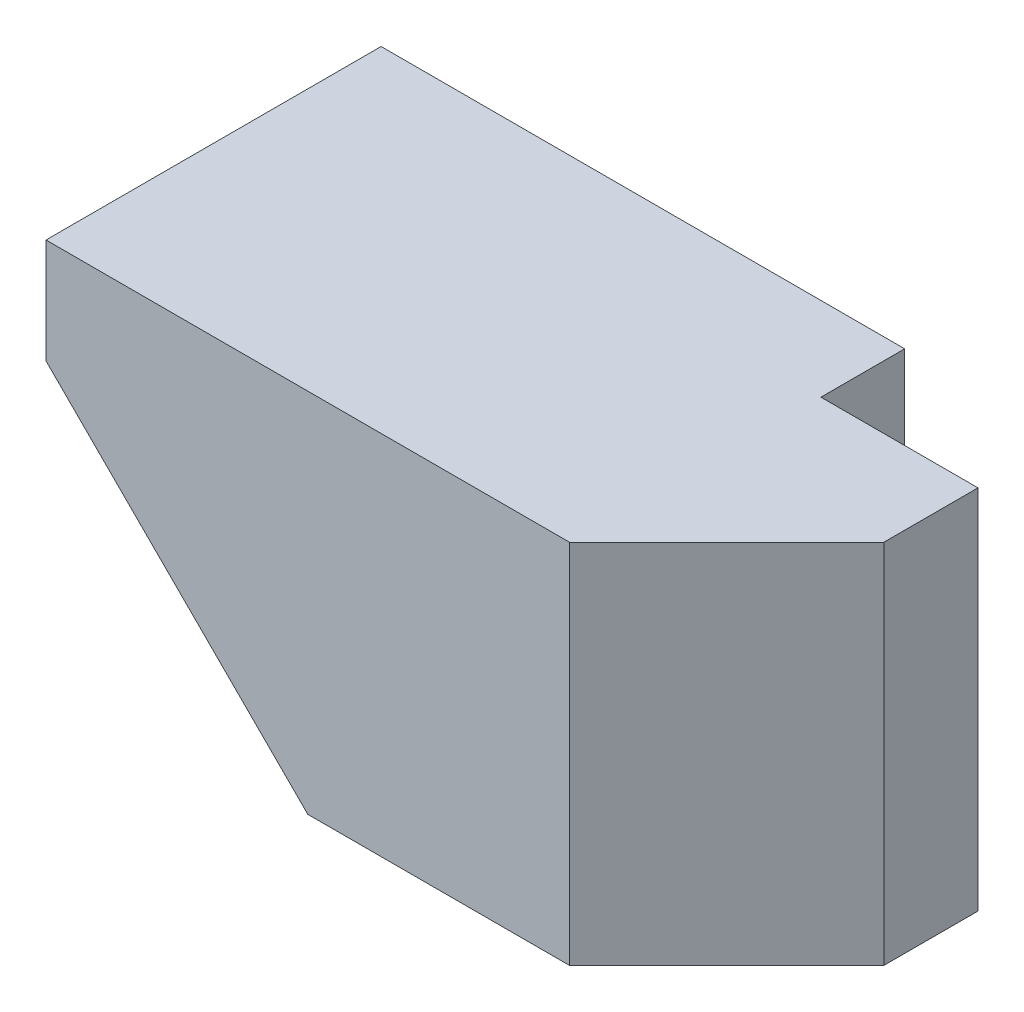
ISO-10303-21;
HEADER;
FILE_DESCRIPTION(('STEP AP214'),'2;1');
FILE_NAME('part.step','',(''),(''),'','','');
FILE_SCHEMA(('AUTOMOTIVE_DESIGN { 1 0 10303 214 1 1 1 1 }'));
ENDSEC;
DATA;
#1=APPLICATION_CONTEXT('core data for automotive mechanical design processes');
#2=APPLICATION_PROTOCOL_DEFINITION('international standard','automotive_design',2000,#1);
#3=PRODUCT_CONTEXT('',#1,'mechanical');
#4=PRODUCT('Part','Part','',(#3));
#5=PRODUCT_RELATED_PRODUCT_CATEGORY('part','',(#4));
#6=PRODUCT_DEFINITION_FORMATION('','',#4);
#7=PRODUCT_DEFINITION_CONTEXT('part definition',#1,'design');
#8=PRODUCT_DEFINITION('design','',#6,#7);
#9=PRODUCT_DEFINITION_SHAPE('','',#8);
#10=(LENGTH_UNIT() NAMED_UNIT(*) SI_UNIT(.MILLI.,.METRE.));
#11=(NAMED_UNIT(*) PLANE_ANGLE_UNIT() SI_UNIT($,.RADIAN.));
#12=(NAMED_UNIT(*) SI_UNIT($,.STERADIAN.) SOLID_ANGLE_UNIT());
#13=UNCERTAINTY_MEASURE_WITH_UNIT(LENGTH_MEASURE(1.E-05),#10,'distance_accuracy_value','');
#14=(GEOMETRIC_REPRESENTATION_CONTEXT(3) GLOBAL_UNCERTAINTY_ASSIGNED_CONTEXT((#13)) GLOBAL_UNIT_ASSIGNED_CONTEXT((#10,
#11,#12)) REPRESENTATION_CONTEXT('',''));
#15=CARTESIAN_POINT('',(0.,0.,0.));
#16=DIRECTION('',(0.,0.,1.));
#17=DIRECTION('',(1.,0.,0.));
#18=AXIS2_PLACEMENT_3D('',#15,#16,#17);
#19=CARTESIAN_POINT('',(37.9273504273504,-14.732905982906,12.));
#20=DIRECTION('',(-1.,0.,0.));
#21=DIRECTION('',(0.,0.,1.));
#22=AXIS2_PLACEMENT_3D('',#19,#20,#21);
#23=PLANE('',#22);
#24=DIRECTION('',(0.,0.,-1.));
#25=VECTOR('',#24,1.);
#26=CARTESIAN_POINT('',(37.9273504273504,20.267094017094,12.));
#27=LINE('',#26,#25);
#28=CARTESIAN_POINT('',(37.9273504273504,20.267094017094,17.));
#29=VERTEX_POINT('',#28);
#30=CARTESIAN_POINT('',(37.9273504273504,20.267094017094,8.));
#31=VERTEX_POINT('',#30);
#32=EDGE_CURVE('E180',#29,#31,#27,.T.);
#33=ORIENTED_EDGE('',*,*,#32,.F.);
#34=DIRECTION('',(0.,-1.,0.));
#35=VECTOR('',#34,1.);
#36=CARTESIAN_POINT('',(37.9273504273504,26.267094017094,17.));
#37=LINE('',#36,#35);
#38=CARTESIAN_POINT('',(37.9273504273504,-14.732905982906,17.));
#39=VERTEX_POINT('',#38);
#40=EDGE_CURVE('E123',#29,#39,#37,.T.);
#41=ORIENTED_EDGE('',*,*,#40,.T.);
#42=DIRECTION('',(0.,0.,-1.));
#43=VECTOR('',#42,1.);
#44=CARTESIAN_POINT('',(37.9273504273504,-14.732905982906,12.));
#45=LINE('',#44,#43);
#46=CARTESIAN_POINT('',(37.9273504273504,-14.732905982906,8.));
#47=VERTEX_POINT('',#46);
#48=EDGE_CURVE('E121',#39,#47,#45,.T.);
#49=ORIENTED_EDGE('',*,*,#48,.T.);
#50=DIRECTION('',(0.,-1.,0.));
#51=VECTOR('',#50,1.);
#52=CARTESIAN_POINT('',(37.9273504273504,20.267094017094,8.));
#53=LINE('',#52,#51);
#54=EDGE_CURVE('E147',#31,#47,#53,.T.);
#55=ORIENTED_EDGE('',*,*,#54,.F.);
#56=EDGE_LOOP('',(#33,#41,#49,#55));
#57=FACE_BOUND('',#56,.T.);
#58=ADVANCED_FACE('F39',(#57),#23,.F.);
#59=CARTESIAN_POINT('',(37.9273504273504,20.267094017094,12.));
#60=DIRECTION('',(0.,-1.,0.));
#61=DIRECTION('',(1.,0.,0.));
#62=AXIS2_PLACEMENT_3D('',#59,#60,#61);
#63=PLANE('',#62);
#64=DIRECTION('',(-1.,0.,0.));
#65=VECTOR('',#64,1.);
#66=CARTESIAN_POINT('',(37.9273504273504,20.267094017094,32.));
#67=LINE('',#66,#65);
#68=CARTESIAN_POINT('',(22.9273504273505,20.267094017094,32.));
#69=VERTEX_POINT('',#68);
#70=CARTESIAN_POINT('',(-27.0726495726496,20.267094017094,32.));
#71=VERTEX_POINT('',#70);
#72=EDGE_CURVE('E141',#69,#71,#67,.T.);
#73=ORIENTED_EDGE('',*,*,#72,.F.);
#74=DIRECTION('',(0.707106781186548,0.,-0.707106781186548));
#75=VECTOR('',#74,1.);
#76=CARTESIAN_POINT('',(40.4273504273504,20.267094017094,14.5));
#77=LINE('',#76,#75);
#78=EDGE_CURVE('E54',#69,#29,#77,.T.);
#79=ORIENTED_EDGE('',*,*,#78,.T.);
#80=ORIENTED_EDGE('',*,*,#32,.T.);
#81=DIRECTION('',(1.,0.,0.));
#82=VECTOR('',#81,1.);
#83=CARTESIAN_POINT('',(22.9273504273504,20.267094017094,8.));
#84=LINE('',#83,#82);
#85=CARTESIAN_POINT('',(22.9273504273504,20.267094017094,8.));
#86=VERTEX_POINT('',#85);
#87=EDGE_CURVE('E159',#86,#31,#84,.T.);
#88=ORIENTED_EDGE('',*,*,#87,.F.);
#89=DIRECTION('',(0.,0.,-1.));
#90=VECTOR('',#89,1.);
#91=CARTESIAN_POINT('',(22.9273504273504,20.267094017094,8.));
#92=LINE('',#91,#90);
#93=CARTESIAN_POINT('',(22.9273504273504,20.267094017094,0.));
#94=VERTEX_POINT('',#93);
#95=EDGE_CURVE('E166',#86,#94,#92,.T.);
#96=ORIENTED_EDGE('',*,*,#95,.T.);
#97=DIRECTION('',(-1.,0.,0.));
#98=VECTOR('',#97,1.);
#99=CARTESIAN_POINT('',(37.9273504273504,20.267094017094,0.));
#100=LINE('',#99,#98);
#101=CARTESIAN_POINT('',(-27.0726495726496,20.267094017094,0.));
#102=VERTEX_POINT('',#101);
#103=EDGE_CURVE('E170',#94,#102,#100,.T.);
#104=ORIENTED_EDGE('',*,*,#103,.T.);
#105=DIRECTION('',(0.,0.,-1.));
#106=VECTOR('',#105,1.);
#107=CARTESIAN_POINT('',(-27.0726495726496,20.267094017094,12.));
#108=LINE('',#107,#106);
#109=EDGE_CURVE('E48',#71,#102,#108,.T.);
#110=ORIENTED_EDGE('',*,*,#109,.F.);
#111=EDGE_LOOP('',(#73,#79,#80,#88,#96,#104,#110));
#112=FACE_BOUND('',#111,.T.);
#113=ADVANCED_FACE('F41',(#112),#63,.F.);
#114=CARTESIAN_POINT('',(-27.0726495726496,20.267094017094,12.));
#115=DIRECTION('',(1.,0.,0.));
#116=DIRECTION('',(0.,0.,-1.));
#117=AXIS2_PLACEMENT_3D('',#114,#115,#116);
#118=PLANE('',#117);
#119=DIRECTION('',(0.,-1.,0.));
#120=VECTOR('',#119,1.);
#121=CARTESIAN_POINT('',(-27.0726495726496,20.267094017094,0.));
#122=LINE('',#121,#120);
#123=CARTESIAN_POINT('',(-27.0726495726496,-14.732905982906,0.));
#124=VERTEX_POINT('',#123);
#125=EDGE_CURVE('E183',#102,#124,#122,.T.);
#126=ORIENTED_EDGE('',*,*,#125,.T.);
#127=DIRECTION('',(0.,0.,-1.));
#128=VECTOR('',#127,1.);
#129=CARTESIAN_POINT('',(-27.0726495726496,-14.732905982906,12.));
#130=LINE('',#129,#128);
#131=CARTESIAN_POINT('',(-27.0726495726496,-14.732905982906,12.));
#132=VERTEX_POINT('',#131);
#133=EDGE_CURVE('E193',#132,#124,#130,.T.);
#134=ORIENTED_EDGE('',*,*,#133,.F.);
#135=DIRECTION('',(0.,-1.,0.));
#136=VECTOR('',#135,1.);
#137=CARTESIAN_POINT('',(-27.0726495726496,20.267094017094,12.));
#138=LINE('',#137,#136);
#139=CARTESIAN_POINT('',(-27.0726495726496,10.267094017094,12.));
#140=VERTEX_POINT('',#139);
#141=EDGE_CURVE('E173',#140,#132,#138,.T.);
#142=ORIENTED_EDGE('',*,*,#141,.F.);
#143=DIRECTION('',(0.,0.,-1.));
#144=VECTOR('',#143,1.);
#145=CARTESIAN_POINT('',(-27.0726495726496,10.267094017094,32.));
#146=LINE('',#145,#144);
#147=CARTESIAN_POINT('',(-27.0726495726496,10.267094017094,32.));
#148=VERTEX_POINT('',#147);
#149=EDGE_CURVE('E134',#148,#140,#146,.T.);
#150=ORIENTED_EDGE('',*,*,#149,.F.);
#151=DIRECTION('',(0.,-1.,0.));
#152=VECTOR('',#151,1.);
#153=CARTESIAN_POINT('',(-27.0726495726496,20.267094017094,32.));
#154=LINE('',#153,#152);
#155=EDGE_CURVE('E136',#71,#148,#154,.T.);
#156=ORIENTED_EDGE('',*,*,#155,.F.);
#157=ORIENTED_EDGE('',*,*,#109,.T.);
#158=EDGE_LOOP('',(#126,#134,#142,#150,#156,#157));
#159=FACE_BOUND('',#158,.T.);
#160=ADVANCED_FACE('F201',(#159),#118,.F.);
#161=CARTESIAN_POINT('',(-27.0726495726496,-14.732905982906,12.));
#162=DIRECTION('',(0.,1.,0.));
#163=DIRECTION('',(0.,0.,1.));
#164=AXIS2_PLACEMENT_3D('',#161,#162,#163);
#165=PLANE('',#164);
#166=ORIENTED_EDGE('',*,*,#48,.F.);
#167=DIRECTION('',(0.707106781186547,0.,-0.707106781186547));
#168=VECTOR('',#167,1.);
#169=CARTESIAN_POINT('',(22.9273504273504,-14.732905982906,32.));
#170=LINE('',#169,#168);
#171=CARTESIAN_POINT('',(22.9273504273504,-14.732905982906,32.));
#172=VERTEX_POINT('',#171);
#173=EDGE_CURVE('E109',#172,#39,#170,.T.);
#174=ORIENTED_EDGE('',*,*,#173,.F.);
#175=DIRECTION('',(1.,0.,0.));
#176=VECTOR('',#175,1.);
#177=CARTESIAN_POINT('',(-2.07264957264955,-14.732905982906,32.));
#178=LINE('',#177,#176);
#179=CARTESIAN_POINT('',(-2.07264957264955,-14.732905982906,32.));
#180=VERTEX_POINT('',#179);
#181=EDGE_CURVE('E119',#180,#172,#178,.T.);
#182=ORIENTED_EDGE('',*,*,#181,.F.);
#183=DIRECTION('',(0.,0.,-1.));
#184=VECTOR('',#183,1.);
#185=CARTESIAN_POINT('',(-2.07264957264955,-14.732905982906,32.));
#186=LINE('',#185,#184);
#187=CARTESIAN_POINT('',(-2.07264957264955,-14.732905982906,12.));
#188=VERTEX_POINT('',#187);
#189=EDGE_CURVE('E130',#180,#188,#186,.T.);
#190=ORIENTED_EDGE('',*,*,#189,.T.);
#191=DIRECTION('',(1.,0.,0.));
#192=VECTOR('',#191,1.);
#193=CARTESIAN_POINT('',(-27.0726495726496,-14.732905982906,12.));
#194=LINE('',#193,#192);
#195=EDGE_CURVE('E176',#132,#188,#194,.T.);
#196=ORIENTED_EDGE('',*,*,#195,.F.);
#197=ORIENTED_EDGE('',*,*,#133,.T.);
#198=DIRECTION('',(1.,0.,0.));
#199=VECTOR('',#198,1.);
#200=CARTESIAN_POINT('',(-27.0726495726496,-14.732905982906,0.));
#201=LINE('',#200,#199);
#202=CARTESIAN_POINT('',(22.9273504273505,-14.732905982906,0.));
#203=VERTEX_POINT('',#202);
#204=EDGE_CURVE('E177',#124,#203,#201,.T.);
#205=ORIENTED_EDGE('',*,*,#204,.T.);
#206=DIRECTION('',(0.,0.,-1.));
#207=VECTOR('',#206,1.);
#208=CARTESIAN_POINT('',(22.9273504273504,-14.732905982906,8.));
#209=LINE('',#208,#207);
#210=CARTESIAN_POINT('',(22.9273504273504,-14.732905982906,8.));
#211=VERTEX_POINT('',#210);
#212=EDGE_CURVE('E163',#211,#203,#209,.T.);
#213=ORIENTED_EDGE('',*,*,#212,.F.);
#214=DIRECTION('',(-1.,0.,0.));
#215=VECTOR('',#214,1.);
#216=CARTESIAN_POINT('',(37.9273504273504,-14.732905982906,8.));
#217=LINE('',#216,#215);
#218=EDGE_CURVE('E151',#47,#211,#217,.T.);
#219=ORIENTED_EDGE('',*,*,#218,.F.);
#220=EDGE_LOOP('',(#166,#174,#182,#190,#196,#197,#205,#213,#219));
#221=FACE_BOUND('',#220,.T.);
#222=ADVANCED_FACE('F117',(#221),#165,.F.);
#223=CARTESIAN_POINT('',(0.,0.,12.));
#224=DIRECTION('',(0.,0.,1.));
#225=DIRECTION('',(1.,0.,0.));
#226=AXIS2_PLACEMENT_3D('',#223,#224,#225);
#227=PLANE('',#226);
#228=DIRECTION('',(0.707106781186547,-0.707106781186547,0.));
#229=VECTOR('',#228,1.);
#230=CARTESIAN_POINT('',(-27.0726495726496,10.267094017094,12.));
#231=LINE('',#230,#229);
#232=EDGE_CURVE('E62',#140,#188,#231,.T.);
#233=ORIENTED_EDGE('',*,*,#232,.F.);
#234=ORIENTED_EDGE('',*,*,#141,.T.);
#235=ORIENTED_EDGE('',*,*,#195,.T.);
#236=EDGE_LOOP('',(#233,#234,#235));
#237=FACE_BOUND('',#236,.T.);
#238=ADVANCED_FACE('F238',(#237),#227,.T.);
#239=CARTESIAN_POINT('',(0.,0.,0.));
#240=DIRECTION('',(0.,0.,1.));
#241=DIRECTION('',(1.,0.,0.));
#242=AXIS2_PLACEMENT_3D('',#239,#240,#241);
#243=PLANE('',#242);
#244=ORIENTED_EDGE('',*,*,#103,.F.);
#245=DIRECTION('',(0.,1.,0.));
#246=VECTOR('',#245,1.);
#247=CARTESIAN_POINT('',(22.9273504273504,-14.732905982906,0.));
#248=LINE('',#247,#246);
#249=EDGE_CURVE('E146',#203,#94,#248,.T.);
#250=ORIENTED_EDGE('',*,*,#249,.F.);
#251=ORIENTED_EDGE('',*,*,#204,.F.);
#252=ORIENTED_EDGE('',*,*,#125,.F.);
#253=EDGE_LOOP('',(#244,#250,#251,#252));
#254=FACE_BOUND('',#253,.T.);
#255=ADVANCED_FACE('F211',(#254),#243,.F.);
#256=CARTESIAN_POINT('',(22.9273504273504,-14.732905982906,8.));
#257=DIRECTION('',(-1.,0.,0.));
#258=DIRECTION('',(0.,0.,1.));
#259=AXIS2_PLACEMENT_3D('',#256,#257,#258);
#260=PLANE('',#259);
#261=ORIENTED_EDGE('',*,*,#249,.T.);
#262=ORIENTED_EDGE('',*,*,#95,.F.);
#263=DIRECTION('',(0.,1.,0.));
#264=VECTOR('',#263,1.);
#265=CARTESIAN_POINT('',(22.9273504273504,-14.732905982906,8.));
#266=LINE('',#265,#264);
#267=EDGE_CURVE('E155',#211,#86,#266,.T.);
#268=ORIENTED_EDGE('',*,*,#267,.F.);
#269=ORIENTED_EDGE('',*,*,#212,.T.);
#270=EDGE_LOOP('',(#261,#262,#268,#269));
#271=FACE_BOUND('',#270,.T.);
#272=ADVANCED_FACE('F224',(#271),#260,.F.);
#273=CARTESIAN_POINT('',(0.,0.,8.));
#274=DIRECTION('',(0.,0.,-1.));
#275=DIRECTION('',(-1.,0.,0.));
#276=AXIS2_PLACEMENT_3D('',#273,#274,#275);
#277=PLANE('',#276);
#278=ORIENTED_EDGE('',*,*,#54,.T.);
#279=ORIENTED_EDGE('',*,*,#218,.T.);
#280=ORIENTED_EDGE('',*,*,#267,.T.);
#281=ORIENTED_EDGE('',*,*,#87,.T.);
#282=EDGE_LOOP('',(#278,#279,#280,#281));
#283=FACE_BOUND('',#282,.T.);
#284=ADVANCED_FACE('F217',(#283),#277,.T.);
#285=CARTESIAN_POINT('',(-27.0726495726496,10.267094017094,32.));
#286=DIRECTION('',(0.707106781186548,0.707106781186548,0.));
#287=DIRECTION('',(-0.707106781186548,0.707106781186548,0.));
#288=AXIS2_PLACEMENT_3D('',#285,#286,#287);
#289=PLANE('',#288);
#290=ORIENTED_EDGE('',*,*,#232,.T.);
#291=ORIENTED_EDGE('',*,*,#189,.F.);
#292=DIRECTION('',(0.707106781186547,-0.707106781186547,0.));
#293=VECTOR('',#292,1.);
#294=CARTESIAN_POINT('',(-27.0726495726496,10.267094017094,32.));
#295=LINE('',#294,#293);
#296=EDGE_CURVE('E127',#148,#180,#295,.T.);
#297=ORIENTED_EDGE('',*,*,#296,.F.);
#298=ORIENTED_EDGE('',*,*,#149,.T.);
#299=EDGE_LOOP('',(#290,#291,#297,#298));
#300=FACE_BOUND('',#299,.T.);
#301=ADVANCED_FACE('F215',(#300),#289,.F.);
#302=CARTESIAN_POINT('',(0.,0.,32.));
#303=DIRECTION('',(0.,0.,1.));
#304=DIRECTION('',(1.,0.,0.));
#305=AXIS2_PLACEMENT_3D('',#302,#303,#304);
#306=PLANE('',#305);
#307=DIRECTION('',(0.,-1.,0.));
#308=VECTOR('',#307,1.);
#309=CARTESIAN_POINT('',(22.9273504273505,0.,32.));
#310=LINE('',#309,#308);
#311=EDGE_CURVE('E11',#69,#172,#310,.T.);
#312=ORIENTED_EDGE('',*,*,#311,.F.);
#313=ORIENTED_EDGE('',*,*,#72,.T.);
#314=ORIENTED_EDGE('',*,*,#155,.T.);
#315=ORIENTED_EDGE('',*,*,#296,.T.);
#316=ORIENTED_EDGE('',*,*,#181,.T.);
#317=EDGE_LOOP('',(#312,#313,#314,#315,#316));
#318=FACE_BOUND('',#317,.T.);
#319=ADVANCED_FACE('F125',(#318),#306,.T.);
#320=CARTESIAN_POINT('',(22.9273504273504,26.267094017094,32.));
#321=DIRECTION('',(-0.707106781186547,0.,-0.707106781186547));
#322=DIRECTION('',(-0.707106781186548,0.,0.707106781186548));
#323=AXIS2_PLACEMENT_3D('',#320,#321,#322);
#324=PLANE('',#323);
#325=ORIENTED_EDGE('',*,*,#311,.T.);
#326=ORIENTED_EDGE('',*,*,#173,.T.);
#327=ORIENTED_EDGE('',*,*,#40,.F.);
#328=ORIENTED_EDGE('',*,*,#78,.F.);
#329=EDGE_LOOP('',(#325,#326,#327,#328));
#330=FACE_BOUND('',#329,.T.);
#331=ADVANCED_FACE('F108',(#330),#324,.F.);
#332=CLOSED_SHELL('',(#58,#113,#160,#222,#238,#255,#272,#284,#301,#319,#331));
#333=MANIFOLD_SOLID_BREP('B2',#332);
#334=ADVANCED_BREP_SHAPE_REPRESENTATION('',(#18,#333),#14);
#335=SHAPE_DEFINITION_REPRESENTATION(#9,#334);
ENDSEC;
END-ISO-10303-21;
